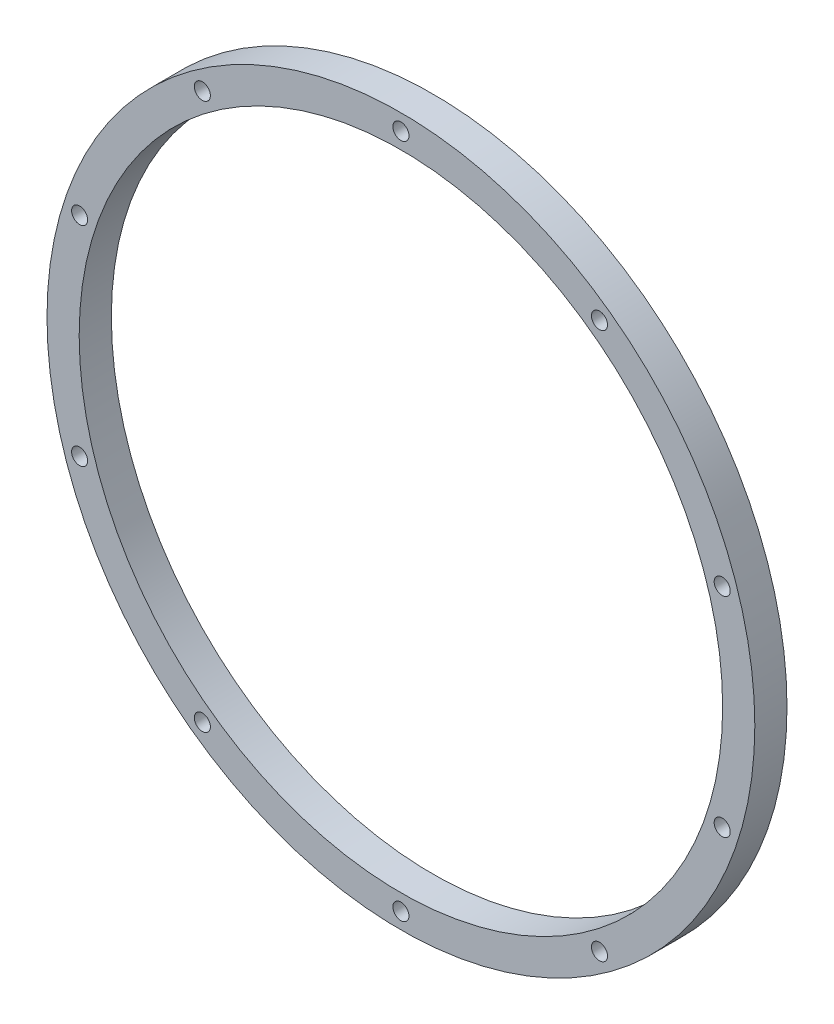
ISO-10303-21;
HEADER;
FILE_DESCRIPTION(('STEP AP214'),'2;1');
FILE_NAME('part.step','',(''),(''),'','','');
FILE_SCHEMA(('AUTOMOTIVE_DESIGN { 1 0 10303 214 1 1 1 1 }'));
ENDSEC;
DATA;
#1=APPLICATION_CONTEXT('core data for automotive mechanical design processes');
#2=APPLICATION_PROTOCOL_DEFINITION('international standard','automotive_design',2000,#1);
#3=PRODUCT_CONTEXT('',#1,'mechanical');
#4=PRODUCT('Part','Part','',(#3));
#5=PRODUCT_RELATED_PRODUCT_CATEGORY('part','',(#4));
#6=PRODUCT_DEFINITION_FORMATION('','',#4);
#7=PRODUCT_DEFINITION_CONTEXT('part definition',#1,'design');
#8=PRODUCT_DEFINITION('design','',#6,#7);
#9=PRODUCT_DEFINITION_SHAPE('','',#8);
#10=(LENGTH_UNIT() NAMED_UNIT(*) SI_UNIT(.MILLI.,.METRE.));
#11=(NAMED_UNIT(*) PLANE_ANGLE_UNIT() SI_UNIT($,.RADIAN.));
#12=(NAMED_UNIT(*) SI_UNIT($,.STERADIAN.) SOLID_ANGLE_UNIT());
#13=UNCERTAINTY_MEASURE_WITH_UNIT(LENGTH_MEASURE(1.E-05),#10,'distance_accuracy_value','');
#14=(GEOMETRIC_REPRESENTATION_CONTEXT(3) GLOBAL_UNCERTAINTY_ASSIGNED_CONTEXT((#13)) GLOBAL_UNIT_ASSIGNED_CONTEXT((#10,
#11,#12)) REPRESENTATION_CONTEXT('',''));
#15=CARTESIAN_POINT('',(0.,0.,0.));
#16=DIRECTION('',(0.,0.,1.));
#17=DIRECTION('',(1.,0.,0.));
#18=AXIS2_PLACEMENT_3D('',#15,#16,#17);
#19=CARTESIAN_POINT('',(0.,0.,-11.7));
#20=DIRECTION('',(0.,0.,1.));
#21=DIRECTION('',(1.,0.,0.));
#22=AXIS2_PLACEMENT_3D('',#19,#20,#21);
#23=CYLINDRICAL_SURFACE('',#22,128.7);
#24=CARTESIAN_POINT('',(0.,0.,-11.7));
#25=DIRECTION('',(0.,0.,1.));
#26=DIRECTION('',(1.,0.,0.));
#27=AXIS2_PLACEMENT_3D('',#24,#25,#26);
#28=CIRCLE('',#27,128.7);
#29=CARTESIAN_POINT('',(128.7,0.,-11.7));
#30=VERTEX_POINT('',#29);
#31=EDGE_CURVE('E10',#30,#30,#28,.T.);
#32=ORIENTED_EDGE('',*,*,#31,.T.);
#33=EDGE_LOOP('',(#32));
#34=FACE_BOUND('',#33,.T.);
#35=CARTESIAN_POINT('',(0.,0.,0.));
#36=DIRECTION('',(0.,0.,1.));
#37=DIRECTION('',(1.,0.,0.));
#38=AXIS2_PLACEMENT_3D('',#35,#36,#37);
#39=CIRCLE('',#38,128.7);
#40=CARTESIAN_POINT('',(128.7,0.,0.));
#41=VERTEX_POINT('',#40);
#42=EDGE_CURVE('E35',#41,#41,#39,.T.);
#43=ORIENTED_EDGE('',*,*,#42,.F.);
#44=EDGE_LOOP('',(#43));
#45=FACE_BOUND('',#44,.T.);
#46=ADVANCED_FACE('F32',(#34,#45),#23,.T.);
#47=CARTESIAN_POINT('',(0.,0.,-11.7));
#48=DIRECTION('',(0.,0.,1.));
#49=DIRECTION('',(1.,0.,0.));
#50=AXIS2_PLACEMENT_3D('',#47,#48,#49);
#51=PLANE('',#50);
#52=CARTESIAN_POINT('',(72.209418244129,99.3877377589632,-11.7));
#53=DIRECTION('',(0.,0.,1.));
#54=DIRECTION('',(0.809016994374955,-0.587785252292462,0.));
#55=AXIS2_PLACEMENT_3D('',#52,#53,#54);
#56=CIRCLE('',#55,2.925);
#57=CARTESIAN_POINT('',(74.5757929526758,97.6684658960078,-11.7));
#58=VERTEX_POINT('',#57);
#59=EDGE_CURVE('E101',#58,#58,#56,.T.);
#60=ORIENTED_EDGE('',*,*,#59,.T.);
#61=EDGE_LOOP('',(#60));
#62=FACE_BOUND('',#61,.T.);
#63=CARTESIAN_POINT('',(116.837293026859,37.9627377589636,-11.7));
#64=DIRECTION('',(0.,0.,1.));
#65=DIRECTION('',(0.309016994374958,-0.95105651629515,0.));
#66=AXIS2_PLACEMENT_3D('',#63,#64,#65);
#67=CIRCLE('',#66,2.925);
#68=CARTESIAN_POINT('',(117.741167735406,35.1808974488003,-11.7));
#69=VERTEX_POINT('',#68);
#70=EDGE_CURVE('E95',#69,#69,#67,.T.);
#71=ORIENTED_EDGE('',*,*,#70,.T.);
#72=EDGE_LOOP('',(#71));
#73=FACE_BOUND('',#72,.T.);
#74=CARTESIAN_POINT('',(116.83729302686,-37.9627377589612,-11.7));
#75=DIRECTION('',(0.,0.,1.));
#76=DIRECTION('',(-0.309016994374938,-0.951056516295157,0.));
#77=AXIS2_PLACEMENT_3D('',#74,#75,#76);
#78=CIRCLE('',#77,2.925);
#79=CARTESIAN_POINT('',(115.933418318313,-40.7445780691245,-11.7));
#80=VERTEX_POINT('',#79);
#81=EDGE_CURVE('E89',#80,#80,#78,.T.);
#82=ORIENTED_EDGE('',*,*,#81,.T.);
#83=EDGE_LOOP('',(#82));
#84=FACE_BOUND('',#83,.T.);
#85=CARTESIAN_POINT('',(72.2094182441312,-99.3877377589616,-11.7));
#86=DIRECTION('',(0.,0.,1.));
#87=DIRECTION('',(-0.809016994374942,-0.58778525229248,0.));
#88=AXIS2_PLACEMENT_3D('',#85,#86,#87);
#89=CIRCLE('',#88,2.925);
#90=CARTESIAN_POINT('',(69.8430435355845,-101.107009621917,-11.7));
#91=VERTEX_POINT('',#90);
#92=EDGE_CURVE('E83',#91,#91,#89,.T.);
#93=ORIENTED_EDGE('',*,*,#92,.T.);
#94=EDGE_LOOP('',(#93));
#95=FACE_BOUND('',#94,.T.);
#96=CARTESIAN_POINT('',(0.,-122.85,-11.7));
#97=DIRECTION('',(0.,0.,1.));
#98=DIRECTION('',(-1.,0.,0.));
#99=AXIS2_PLACEMENT_3D('',#96,#97,#98);
#100=CIRCLE('',#99,2.925);
#101=CARTESIAN_POINT('',(-2.925,-122.85,-11.7));
#102=VERTEX_POINT('',#101);
#103=EDGE_CURVE('E77',#102,#102,#100,.T.);
#104=ORIENTED_EDGE('',*,*,#103,.T.);
#105=EDGE_LOOP('',(#104));
#106=FACE_BOUND('',#105,.T.);
#107=CARTESIAN_POINT('',(-72.2094182441298,-99.3877377589627,-11.7));
#108=DIRECTION('',(0.,0.,1.));
#109=DIRECTION('',(-0.809016994374951,0.587785252292469,0.));
#110=AXIS2_PLACEMENT_3D('',#107,#108,#109);
#111=CIRCLE('',#110,2.925);
#112=CARTESIAN_POINT('',(-74.5757929526765,-97.6684658960072,-11.7));
#113=VERTEX_POINT('',#112);
#114=EDGE_CURVE('E71',#113,#113,#111,.T.);
#115=ORIENTED_EDGE('',*,*,#114,.T.);
#116=EDGE_LOOP('',(#115));
#117=FACE_BOUND('',#116,.T.);
#118=CARTESIAN_POINT('',(-116.837293026859,-37.9627377589628,-11.7));
#119=DIRECTION('',(0.,0.,1.));
#120=DIRECTION('',(-0.309016994374952,0.951056516295152,0.));
#121=AXIS2_PLACEMENT_3D('',#118,#119,#120);
#122=CIRCLE('',#121,2.925);
#123=CARTESIAN_POINT('',(-117.741167735406,-35.1808974487995,-11.7));
#124=VERTEX_POINT('',#123);
#125=EDGE_CURVE('E65',#124,#124,#122,.T.);
#126=ORIENTED_EDGE('',*,*,#125,.T.);
#127=EDGE_LOOP('',(#126));
#128=FACE_BOUND('',#127,.T.);
#129=CARTESIAN_POINT('',(-116.83729302686,37.962737758962,-11.7));
#130=DIRECTION('',(0.,0.,1.));
#131=DIRECTION('',(0.309016994374945,0.951056516295155,0.));
#132=AXIS2_PLACEMENT_3D('',#129,#130,#131);
#133=CIRCLE('',#132,2.925);
#134=CARTESIAN_POINT('',(-115.933418318313,40.7445780691253,-11.7));
#135=VERTEX_POINT('',#134);
#136=EDGE_CURVE('E59',#135,#135,#133,.T.);
#137=ORIENTED_EDGE('',*,*,#136,.T.);
#138=EDGE_LOOP('',(#137));
#139=FACE_BOUND('',#138,.T.);
#140=CARTESIAN_POINT('',(-72.2094182441305,99.3877377589622,-11.7));
#141=DIRECTION('',(0.,0.,1.));
#142=DIRECTION('',(0.809016994374947,0.587785252292474,0.));
#143=AXIS2_PLACEMENT_3D('',#140,#141,#142);
#144=CIRCLE('',#143,2.925);
#145=CARTESIAN_POINT('',(-69.8430435355838,101.107009621918,-11.7));
#146=VERTEX_POINT('',#145);
#147=EDGE_CURVE('E53',#146,#146,#144,.T.);
#148=ORIENTED_EDGE('',*,*,#147,.T.);
#149=EDGE_LOOP('',(#148));
#150=FACE_BOUND('',#149,.T.);
#151=CARTESIAN_POINT('',(0.,122.85,-11.7));
#152=DIRECTION('',(0.,0.,1.));
#153=DIRECTION('',(1.,0.,0.));
#154=AXIS2_PLACEMENT_3D('',#151,#152,#153);
#155=CIRCLE('',#154,2.925);
#156=CARTESIAN_POINT('',(2.925,122.85,-11.7));
#157=VERTEX_POINT('',#156);
#158=EDGE_CURVE('E47',#157,#157,#155,.T.);
#159=ORIENTED_EDGE('',*,*,#158,.T.);
#160=EDGE_LOOP('',(#159));
#161=FACE_BOUND('',#160,.T.);
#162=CARTESIAN_POINT('',(0.,0.,-11.7));
#163=DIRECTION('',(0.,0.,1.));
#164=DIRECTION('',(1.,0.,0.));
#165=AXIS2_PLACEMENT_3D('',#162,#163,#164);
#166=CIRCLE('',#165,117.);
#167=CARTESIAN_POINT('',(117.,0.,-11.7));
#168=VERTEX_POINT('',#167);
#169=EDGE_CURVE('E42',#168,#168,#166,.T.);
#170=ORIENTED_EDGE('',*,*,#169,.T.);
#171=EDGE_LOOP('',(#170));
#172=FACE_BOUND('',#171,.T.);
#173=ORIENTED_EDGE('',*,*,#31,.F.);
#174=EDGE_LOOP('',(#173));
#175=FACE_BOUND('',#174,.T.);
#176=ADVANCED_FACE('F110',(#62,#73,#84,#95,#106,#117,#128,#139,#150,#161,#172,#175),#51,.F.);
#177=CARTESIAN_POINT('',(0.,0.,0.));
#178=DIRECTION('',(0.,0.,1.));
#179=DIRECTION('',(1.,0.,0.));
#180=AXIS2_PLACEMENT_3D('',#177,#178,#179);
#181=PLANE('',#180);
#182=CARTESIAN_POINT('',(72.209418244129,99.3877377589632,0.));
#183=DIRECTION('',(0.,0.,1.));
#184=DIRECTION('',(0.809016994374955,-0.587785252292462,0.));
#185=AXIS2_PLACEMENT_3D('',#182,#183,#184);
#186=CIRCLE('',#185,2.925);
#187=CARTESIAN_POINT('',(74.5757929526758,97.6684658960078,0.));
#188=VERTEX_POINT('',#187);
#189=EDGE_CURVE('E104',#188,#188,#186,.T.);
#190=ORIENTED_EDGE('',*,*,#189,.F.);
#191=EDGE_LOOP('',(#190));
#192=FACE_BOUND('',#191,.T.);
#193=CARTESIAN_POINT('',(116.837293026859,37.9627377589636,0.));
#194=DIRECTION('',(0.,0.,1.));
#195=DIRECTION('',(0.309016994374958,-0.95105651629515,0.));
#196=AXIS2_PLACEMENT_3D('',#193,#194,#195);
#197=CIRCLE('',#196,2.925);
#198=CARTESIAN_POINT('',(117.741167735406,35.1808974488003,0.));
#199=VERTEX_POINT('',#198);
#200=EDGE_CURVE('E98',#199,#199,#197,.T.);
#201=ORIENTED_EDGE('',*,*,#200,.F.);
#202=EDGE_LOOP('',(#201));
#203=FACE_BOUND('',#202,.T.);
#204=CARTESIAN_POINT('',(116.83729302686,-37.9627377589612,0.));
#205=DIRECTION('',(0.,0.,1.));
#206=DIRECTION('',(-0.309016994374938,-0.951056516295157,0.));
#207=AXIS2_PLACEMENT_3D('',#204,#205,#206);
#208=CIRCLE('',#207,2.925);
#209=CARTESIAN_POINT('',(115.933418318313,-40.7445780691245,0.));
#210=VERTEX_POINT('',#209);
#211=EDGE_CURVE('E92',#210,#210,#208,.T.);
#212=ORIENTED_EDGE('',*,*,#211,.F.);
#213=EDGE_LOOP('',(#212));
#214=FACE_BOUND('',#213,.T.);
#215=CARTESIAN_POINT('',(72.2094182441312,-99.3877377589616,0.));
#216=DIRECTION('',(0.,0.,1.));
#217=DIRECTION('',(-0.809016994374942,-0.58778525229248,0.));
#218=AXIS2_PLACEMENT_3D('',#215,#216,#217);
#219=CIRCLE('',#218,2.925);
#220=CARTESIAN_POINT('',(69.8430435355845,-101.107009621917,0.));
#221=VERTEX_POINT('',#220);
#222=EDGE_CURVE('E86',#221,#221,#219,.T.);
#223=ORIENTED_EDGE('',*,*,#222,.F.);
#224=EDGE_LOOP('',(#223));
#225=FACE_BOUND('',#224,.T.);
#226=CARTESIAN_POINT('',(0.,-122.85,0.));
#227=DIRECTION('',(0.,0.,1.));
#228=DIRECTION('',(-1.,0.,0.));
#229=AXIS2_PLACEMENT_3D('',#226,#227,#228);
#230=CIRCLE('',#229,2.925);
#231=CARTESIAN_POINT('',(-2.925,-122.85,0.));
#232=VERTEX_POINT('',#231);
#233=EDGE_CURVE('E80',#232,#232,#230,.T.);
#234=ORIENTED_EDGE('',*,*,#233,.F.);
#235=EDGE_LOOP('',(#234));
#236=FACE_BOUND('',#235,.T.);
#237=CARTESIAN_POINT('',(-72.2094182441298,-99.3877377589627,0.));
#238=DIRECTION('',(0.,0.,1.));
#239=DIRECTION('',(-0.809016994374951,0.587785252292469,0.));
#240=AXIS2_PLACEMENT_3D('',#237,#238,#239);
#241=CIRCLE('',#240,2.925);
#242=CARTESIAN_POINT('',(-74.5757929526765,-97.6684658960072,0.));
#243=VERTEX_POINT('',#242);
#244=EDGE_CURVE('E74',#243,#243,#241,.T.);
#245=ORIENTED_EDGE('',*,*,#244,.F.);
#246=EDGE_LOOP('',(#245));
#247=FACE_BOUND('',#246,.T.);
#248=CARTESIAN_POINT('',(-116.837293026859,-37.9627377589628,0.));
#249=DIRECTION('',(0.,0.,1.));
#250=DIRECTION('',(-0.309016994374952,0.951056516295152,0.));
#251=AXIS2_PLACEMENT_3D('',#248,#249,#250);
#252=CIRCLE('',#251,2.925);
#253=CARTESIAN_POINT('',(-117.741167735406,-35.1808974487995,0.));
#254=VERTEX_POINT('',#253);
#255=EDGE_CURVE('E68',#254,#254,#252,.T.);
#256=ORIENTED_EDGE('',*,*,#255,.F.);
#257=EDGE_LOOP('',(#256));
#258=FACE_BOUND('',#257,.T.);
#259=CARTESIAN_POINT('',(-116.83729302686,37.962737758962,0.));
#260=DIRECTION('',(0.,0.,1.));
#261=DIRECTION('',(0.309016994374945,0.951056516295155,0.));
#262=AXIS2_PLACEMENT_3D('',#259,#260,#261);
#263=CIRCLE('',#262,2.925);
#264=CARTESIAN_POINT('',(-115.933418318313,40.7445780691253,0.));
#265=VERTEX_POINT('',#264);
#266=EDGE_CURVE('E62',#265,#265,#263,.T.);
#267=ORIENTED_EDGE('',*,*,#266,.F.);
#268=EDGE_LOOP('',(#267));
#269=FACE_BOUND('',#268,.T.);
#270=CARTESIAN_POINT('',(-72.2094182441305,99.3877377589622,0.));
#271=DIRECTION('',(0.,0.,1.));
#272=DIRECTION('',(0.809016994374947,0.587785252292474,0.));
#273=AXIS2_PLACEMENT_3D('',#270,#271,#272);
#274=CIRCLE('',#273,2.925);
#275=CARTESIAN_POINT('',(-69.8430435355838,101.107009621918,0.));
#276=VERTEX_POINT('',#275);
#277=EDGE_CURVE('E56',#276,#276,#274,.T.);
#278=ORIENTED_EDGE('',*,*,#277,.F.);
#279=EDGE_LOOP('',(#278));
#280=FACE_BOUND('',#279,.T.);
#281=CARTESIAN_POINT('',(0.,122.85,0.));
#282=DIRECTION('',(0.,0.,1.));
#283=DIRECTION('',(1.,0.,0.));
#284=AXIS2_PLACEMENT_3D('',#281,#282,#283);
#285=CIRCLE('',#284,2.925);
#286=CARTESIAN_POINT('',(2.925,122.85,0.));
#287=VERTEX_POINT('',#286);
#288=EDGE_CURVE('E50',#287,#287,#285,.T.);
#289=ORIENTED_EDGE('',*,*,#288,.F.);
#290=EDGE_LOOP('',(#289));
#291=FACE_BOUND('',#290,.T.);
#292=CARTESIAN_POINT('',(0.,0.,0.));
#293=DIRECTION('',(0.,0.,1.));
#294=DIRECTION('',(1.,0.,0.));
#295=AXIS2_PLACEMENT_3D('',#292,#293,#294);
#296=CIRCLE('',#295,117.);
#297=CARTESIAN_POINT('',(117.,0.,0.));
#298=VERTEX_POINT('',#297);
#299=EDGE_CURVE('E44',#298,#298,#296,.T.);
#300=ORIENTED_EDGE('',*,*,#299,.F.);
#301=EDGE_LOOP('',(#300));
#302=FACE_BOUND('',#301,.T.);
#303=ORIENTED_EDGE('',*,*,#42,.T.);
#304=EDGE_LOOP('',(#303));
#305=FACE_BOUND('',#304,.T.);
#306=ADVANCED_FACE('F120',(#192,#203,#214,#225,#236,#247,#258,#269,#280,#291,#302,#305),#181,.T.);
#307=CARTESIAN_POINT('',(0.,0.,-11.7));
#308=DIRECTION('',(0.,0.,1.));
#309=DIRECTION('',(1.,0.,0.));
#310=AXIS2_PLACEMENT_3D('',#307,#308,#309);
#311=CYLINDRICAL_SURFACE('',#310,117.);
#312=ORIENTED_EDGE('',*,*,#169,.F.);
#313=EDGE_LOOP('',(#312));
#314=FACE_BOUND('',#313,.T.);
#315=ORIENTED_EDGE('',*,*,#299,.T.);
#316=EDGE_LOOP('',(#315));
#317=FACE_BOUND('',#316,.T.);
#318=ADVANCED_FACE('F123',(#314,#317),#311,.F.);
#319=CARTESIAN_POINT('',(0.,122.85,-11.7));
#320=DIRECTION('',(0.,0.,1.));
#321=DIRECTION('',(1.,0.,0.));
#322=AXIS2_PLACEMENT_3D('',#319,#320,#321);
#323=CYLINDRICAL_SURFACE('',#322,2.925);
#324=ORIENTED_EDGE('',*,*,#158,.F.);
#325=EDGE_LOOP('',(#324));
#326=FACE_BOUND('',#325,.T.);
#327=ORIENTED_EDGE('',*,*,#288,.T.);
#328=EDGE_LOOP('',(#327));
#329=FACE_BOUND('',#328,.T.);
#330=ADVANCED_FACE('F156',(#326,#329),#323,.F.);
#331=CARTESIAN_POINT('',(-72.2094182441305,99.3877377589622,-11.7));
#332=DIRECTION('',(0.,0.,1.));
#333=DIRECTION('',(1.,0.,0.));
#334=AXIS2_PLACEMENT_3D('',#331,#332,#333);
#335=CYLINDRICAL_SURFACE('',#334,2.925);
#336=ORIENTED_EDGE('',*,*,#147,.F.);
#337=EDGE_LOOP('',(#336));
#338=FACE_BOUND('',#337,.T.);
#339=ORIENTED_EDGE('',*,*,#277,.T.);
#340=EDGE_LOOP('',(#339));
#341=FACE_BOUND('',#340,.T.);
#342=ADVANCED_FACE('F160',(#338,#341),#335,.F.);
#343=CARTESIAN_POINT('',(-116.83729302686,37.962737758962,-11.7));
#344=DIRECTION('',(0.,0.,1.));
#345=DIRECTION('',(1.,0.,0.));
#346=AXIS2_PLACEMENT_3D('',#343,#344,#345);
#347=CYLINDRICAL_SURFACE('',#346,2.925);
#348=ORIENTED_EDGE('',*,*,#136,.F.);
#349=EDGE_LOOP('',(#348));
#350=FACE_BOUND('',#349,.T.);
#351=ORIENTED_EDGE('',*,*,#266,.T.);
#352=EDGE_LOOP('',(#351));
#353=FACE_BOUND('',#352,.T.);
#354=ADVANCED_FACE('F164',(#350,#353),#347,.F.);
#355=CARTESIAN_POINT('',(-116.837293026859,-37.9627377589628,-11.7));
#356=DIRECTION('',(0.,0.,1.));
#357=DIRECTION('',(1.,0.,0.));
#358=AXIS2_PLACEMENT_3D('',#355,#356,#357);
#359=CYLINDRICAL_SURFACE('',#358,2.925);
#360=ORIENTED_EDGE('',*,*,#125,.F.);
#361=EDGE_LOOP('',(#360));
#362=FACE_BOUND('',#361,.T.);
#363=ORIENTED_EDGE('',*,*,#255,.T.);
#364=EDGE_LOOP('',(#363));
#365=FACE_BOUND('',#364,.T.);
#366=ADVANCED_FACE('F168',(#362,#365),#359,.F.);
#367=CARTESIAN_POINT('',(-72.2094182441298,-99.3877377589627,-11.7));
#368=DIRECTION('',(0.,0.,1.));
#369=DIRECTION('',(1.,0.,0.));
#370=AXIS2_PLACEMENT_3D('',#367,#368,#369);
#371=CYLINDRICAL_SURFACE('',#370,2.925);
#372=ORIENTED_EDGE('',*,*,#114,.F.);
#373=EDGE_LOOP('',(#372));
#374=FACE_BOUND('',#373,.T.);
#375=ORIENTED_EDGE('',*,*,#244,.T.);
#376=EDGE_LOOP('',(#375));
#377=FACE_BOUND('',#376,.T.);
#378=ADVANCED_FACE('F172',(#374,#377),#371,.F.);
#379=CARTESIAN_POINT('',(0.,-122.85,-11.7));
#380=DIRECTION('',(0.,0.,1.));
#381=DIRECTION('',(1.,0.,0.));
#382=AXIS2_PLACEMENT_3D('',#379,#380,#381);
#383=CYLINDRICAL_SURFACE('',#382,2.925);
#384=ORIENTED_EDGE('',*,*,#103,.F.);
#385=EDGE_LOOP('',(#384));
#386=FACE_BOUND('',#385,.T.);
#387=ORIENTED_EDGE('',*,*,#233,.T.);
#388=EDGE_LOOP('',(#387));
#389=FACE_BOUND('',#388,.T.);
#390=ADVANCED_FACE('F176',(#386,#389),#383,.F.);
#391=CARTESIAN_POINT('',(72.2094182441312,-99.3877377589616,-11.7));
#392=DIRECTION('',(0.,0.,1.));
#393=DIRECTION('',(1.,0.,0.));
#394=AXIS2_PLACEMENT_3D('',#391,#392,#393);
#395=CYLINDRICAL_SURFACE('',#394,2.925);
#396=ORIENTED_EDGE('',*,*,#92,.F.);
#397=EDGE_LOOP('',(#396));
#398=FACE_BOUND('',#397,.T.);
#399=ORIENTED_EDGE('',*,*,#222,.T.);
#400=EDGE_LOOP('',(#399));
#401=FACE_BOUND('',#400,.T.);
#402=ADVANCED_FACE('F180',(#398,#401),#395,.F.);
#403=CARTESIAN_POINT('',(116.83729302686,-37.9627377589612,-11.7));
#404=DIRECTION('',(0.,0.,1.));
#405=DIRECTION('',(1.,0.,0.));
#406=AXIS2_PLACEMENT_3D('',#403,#404,#405);
#407=CYLINDRICAL_SURFACE('',#406,2.925);
#408=ORIENTED_EDGE('',*,*,#81,.F.);
#409=EDGE_LOOP('',(#408));
#410=FACE_BOUND('',#409,.T.);
#411=ORIENTED_EDGE('',*,*,#211,.T.);
#412=EDGE_LOOP('',(#411));
#413=FACE_BOUND('',#412,.T.);
#414=ADVANCED_FACE('F184',(#410,#413),#407,.F.);
#415=CARTESIAN_POINT('',(116.837293026859,37.9627377589636,-11.7));
#416=DIRECTION('',(0.,0.,1.));
#417=DIRECTION('',(1.,0.,0.));
#418=AXIS2_PLACEMENT_3D('',#415,#416,#417);
#419=CYLINDRICAL_SURFACE('',#418,2.925);
#420=ORIENTED_EDGE('',*,*,#70,.F.);
#421=EDGE_LOOP('',(#420));
#422=FACE_BOUND('',#421,.T.);
#423=ORIENTED_EDGE('',*,*,#200,.T.);
#424=EDGE_LOOP('',(#423));
#425=FACE_BOUND('',#424,.T.);
#426=ADVANCED_FACE('F116',(#422,#425),#419,.F.);
#427=CARTESIAN_POINT('',(72.209418244129,99.3877377589632,-11.7));
#428=DIRECTION('',(0.,0.,1.));
#429=DIRECTION('',(1.,0.,0.));
#430=AXIS2_PLACEMENT_3D('',#427,#428,#429);
#431=CYLINDRICAL_SURFACE('',#430,2.925);
#432=ORIENTED_EDGE('',*,*,#59,.F.);
#433=EDGE_LOOP('',(#432));
#434=FACE_BOUND('',#433,.T.);
#435=ORIENTED_EDGE('',*,*,#189,.T.);
#436=EDGE_LOOP('',(#435));
#437=FACE_BOUND('',#436,.T.);
#438=ADVANCED_FACE('F113',(#434,#437),#431,.F.);
#439=CLOSED_SHELL('',(#46,#176,#306,#318,#330,#342,#354,#366,#378,#390,#402,#414,#426,#438));
#440=MANIFOLD_SOLID_BREP('B2',#439);
#441=ADVANCED_BREP_SHAPE_REPRESENTATION('',(#18,#440),#14);
#442=SHAPE_DEFINITION_REPRESENTATION(#9,#441);
ENDSEC;
END-ISO-10303-21;
